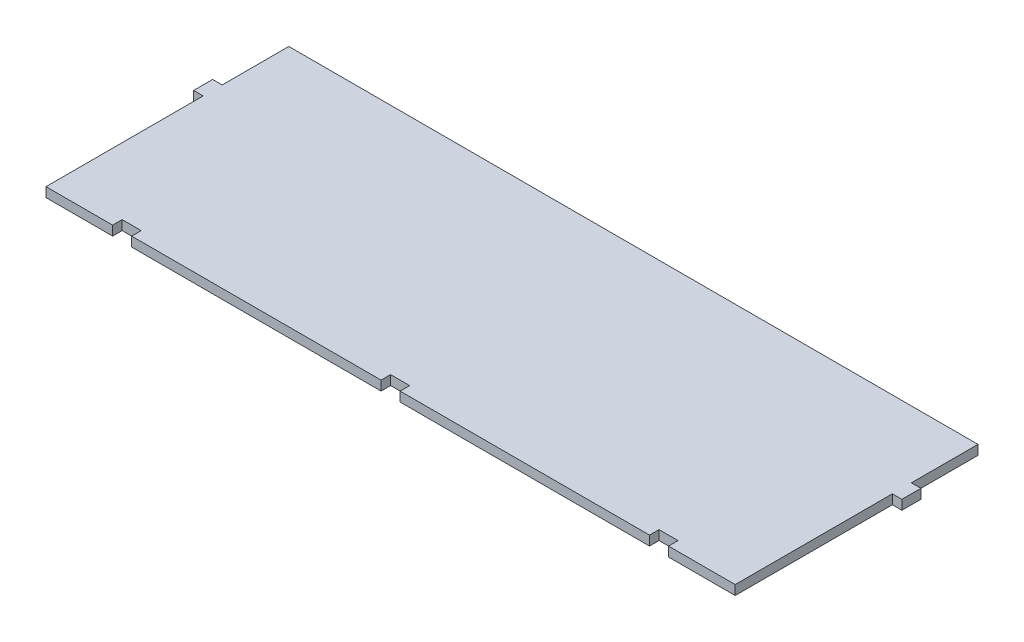
ISO-10303-21;
HEADER;
FILE_DESCRIPTION(('STEP AP214'),'2;1');
FILE_NAME('part.step','',(''),(''),'','','');
FILE_SCHEMA(('AUTOMOTIVE_DESIGN { 1 0 10303 214 1 1 1 1 }'));
ENDSEC;
DATA;
#1=APPLICATION_CONTEXT('core data for automotive mechanical design processes');
#2=APPLICATION_PROTOCOL_DEFINITION('international standard','automotive_design',2000,#1);
#3=PRODUCT_CONTEXT('',#1,'mechanical');
#4=PRODUCT('Part','Part','',(#3));
#5=PRODUCT_RELATED_PRODUCT_CATEGORY('part','',(#4));
#6=PRODUCT_DEFINITION_FORMATION('','',#4);
#7=PRODUCT_DEFINITION_CONTEXT('part definition',#1,'design');
#8=PRODUCT_DEFINITION('design','',#6,#7);
#9=PRODUCT_DEFINITION_SHAPE('','',#8);
#10=(LENGTH_UNIT() NAMED_UNIT(*) SI_UNIT(.MILLI.,.METRE.));
#11=(NAMED_UNIT(*) PLANE_ANGLE_UNIT() SI_UNIT($,.RADIAN.));
#12=(NAMED_UNIT(*) SI_UNIT($,.STERADIAN.) SOLID_ANGLE_UNIT());
#13=UNCERTAINTY_MEASURE_WITH_UNIT(LENGTH_MEASURE(1.E-05),#10,'distance_accuracy_value','');
#14=(GEOMETRIC_REPRESENTATION_CONTEXT(3) GLOBAL_UNCERTAINTY_ASSIGNED_CONTEXT((#13)) GLOBAL_UNIT_ASSIGNED_CONTEXT((#10,
#11,#12)) REPRESENTATION_CONTEXT('',''));
#15=CARTESIAN_POINT('',(0.,0.,0.));
#16=DIRECTION('',(0.,0.,1.));
#17=DIRECTION('',(1.,0.,0.));
#18=AXIS2_PLACEMENT_3D('',#15,#16,#17);
#19=CARTESIAN_POINT('',(-146.,5.,58.845));
#20=DIRECTION('',(0.,0.,-1.));
#21=DIRECTION('',(-1.,0.,0.));
#22=AXIS2_PLACEMENT_3D('',#19,#20,#21);
#23=PLANE('',#22);
#24=DIRECTION('',(1.,0.,0.));
#25=VECTOR('',#24,1.);
#26=CARTESIAN_POINT('',(-146.,0.,58.845));
#27=LINE('',#26,#25);
#28=CARTESIAN_POINT('',(-181.,0.,58.845));
#29=VERTEX_POINT('',#28);
#30=CARTESIAN_POINT('',(-146.,0.,58.845));
#31=VERTEX_POINT('',#30);
#32=EDGE_CURVE('E236',#29,#31,#27,.T.);
#33=ORIENTED_EDGE('',*,*,#32,.T.);
#34=DIRECTION('',(0.,-1.,0.));
#35=VECTOR('',#34,1.);
#36=CARTESIAN_POINT('',(-146.,5.,58.845));
#37=LINE('',#36,#35);
#38=CARTESIAN_POINT('',(-146.,5.,58.845));
#39=VERTEX_POINT('',#38);
#40=EDGE_CURVE('E11',#39,#31,#37,.T.);
#41=ORIENTED_EDGE('',*,*,#40,.F.);
#42=DIRECTION('',(1.,0.,0.));
#43=VECTOR('',#42,1.);
#44=CARTESIAN_POINT('',(-146.,5.,58.845));
#45=LINE('',#44,#43);
#46=CARTESIAN_POINT('',(-181.,5.,58.845));
#47=VERTEX_POINT('',#46);
#48=EDGE_CURVE('E306',#47,#39,#45,.T.);
#49=ORIENTED_EDGE('',*,*,#48,.F.);
#50=DIRECTION('',(0.,-1.,0.));
#51=VECTOR('',#50,1.);
#52=CARTESIAN_POINT('',(-181.,5.,58.845));
#53=LINE('',#52,#51);
#54=EDGE_CURVE('E232',#47,#29,#53,.T.);
#55=ORIENTED_EDGE('',*,*,#54,.T.);
#56=EDGE_LOOP('',(#33,#41,#49,#55));
#57=FACE_BOUND('',#56,.T.);
#58=ADVANCED_FACE('F39',(#57),#23,.F.);
#59=CARTESIAN_POINT('',(-146.,5.,58.845));
#60=DIRECTION('',(-1.,0.,0.));
#61=DIRECTION('',(0.,0.,1.));
#62=AXIS2_PLACEMENT_3D('',#59,#60,#61);
#63=PLANE('',#62);
#64=DIRECTION('',(0.,0.,-1.));
#65=VECTOR('',#64,1.);
#66=CARTESIAN_POINT('',(-146.,0.,58.845));
#67=LINE('',#66,#65);
#68=CARTESIAN_POINT('',(-146.,0.,53.845));
#69=VERTEX_POINT('',#68);
#70=EDGE_CURVE('E240',#31,#69,#67,.T.);
#71=ORIENTED_EDGE('',*,*,#70,.T.);
#72=DIRECTION('',(0.,-1.,0.));
#73=VECTOR('',#72,1.);
#74=CARTESIAN_POINT('',(-146.,5.,53.845));
#75=LINE('',#74,#73);
#76=CARTESIAN_POINT('',(-146.,5.,53.845));
#77=VERTEX_POINT('',#76);
#78=EDGE_CURVE('E48',#77,#69,#75,.T.);
#79=ORIENTED_EDGE('',*,*,#78,.F.);
#80=DIRECTION('',(0.,0.,-1.));
#81=VECTOR('',#80,1.);
#82=CARTESIAN_POINT('',(-146.,5.,58.845));
#83=LINE('',#82,#81);
#84=EDGE_CURVE('E147',#39,#77,#83,.T.);
#85=ORIENTED_EDGE('',*,*,#84,.F.);
#86=ORIENTED_EDGE('',*,*,#40,.T.);
#87=EDGE_LOOP('',(#71,#79,#85,#86));
#88=FACE_BOUND('',#87,.T.);
#89=ADVANCED_FACE('F484',(#88),#63,.F.);
#90=CARTESIAN_POINT('',(-146.,5.,53.845));
#91=DIRECTION('',(0.,0.,-1.));
#92=DIRECTION('',(-1.,0.,0.));
#93=AXIS2_PLACEMENT_3D('',#90,#91,#92);
#94=PLANE('',#93);
#95=DIRECTION('',(1.,0.,0.));
#96=VECTOR('',#95,1.);
#97=CARTESIAN_POINT('',(-146.,0.,53.845));
#98=LINE('',#97,#96);
#99=CARTESIAN_POINT('',(-136.,0.,53.845));
#100=VERTEX_POINT('',#99);
#101=EDGE_CURVE('E243',#69,#100,#98,.T.);
#102=ORIENTED_EDGE('',*,*,#101,.T.);
#103=DIRECTION('',(0.,-1.,0.));
#104=VECTOR('',#103,1.);
#105=CARTESIAN_POINT('',(-136.,5.,53.845));
#106=LINE('',#105,#104);
#107=CARTESIAN_POINT('',(-136.,5.,53.845));
#108=VERTEX_POINT('',#107);
#109=EDGE_CURVE('E381',#108,#100,#106,.T.);
#110=ORIENTED_EDGE('',*,*,#109,.F.);
#111=DIRECTION('',(1.,0.,0.));
#112=VECTOR('',#111,1.);
#113=CARTESIAN_POINT('',(-146.,5.,53.845));
#114=LINE('',#113,#112);
#115=EDGE_CURVE('E391',#77,#108,#114,.T.);
#116=ORIENTED_EDGE('',*,*,#115,.F.);
#117=ORIENTED_EDGE('',*,*,#78,.T.);
#118=EDGE_LOOP('',(#102,#110,#116,#117));
#119=FACE_BOUND('',#118,.T.);
#120=ADVANCED_FACE('F389',(#119),#94,.F.);
#121=CARTESIAN_POINT('',(-136.,5.,53.845));
#122=DIRECTION('',(1.,0.,0.));
#123=DIRECTION('',(0.,0.,-1.));
#124=AXIS2_PLACEMENT_3D('',#121,#122,#123);
#125=PLANE('',#124);
#126=DIRECTION('',(0.,0.,1.));
#127=VECTOR('',#126,1.);
#128=CARTESIAN_POINT('',(-136.,0.,53.845));
#129=LINE('',#128,#127);
#130=CARTESIAN_POINT('',(-136.,0.,58.845));
#131=VERTEX_POINT('',#130);
#132=EDGE_CURVE('E246',#100,#131,#129,.T.);
#133=ORIENTED_EDGE('',*,*,#132,.T.);
#134=DIRECTION('',(0.,-1.,0.));
#135=VECTOR('',#134,1.);
#136=CARTESIAN_POINT('',(-136.,5.,58.845));
#137=LINE('',#136,#135);
#138=CARTESIAN_POINT('',(-136.,5.,58.845));
#139=VERTEX_POINT('',#138);
#140=EDGE_CURVE('E377',#139,#131,#137,.T.);
#141=ORIENTED_EDGE('',*,*,#140,.F.);
#142=DIRECTION('',(0.,0.,1.));
#143=VECTOR('',#142,1.);
#144=CARTESIAN_POINT('',(-136.,5.,53.845));
#145=LINE('',#144,#143);
#146=EDGE_CURVE('E410',#108,#139,#145,.T.);
#147=ORIENTED_EDGE('',*,*,#146,.F.);
#148=ORIENTED_EDGE('',*,*,#109,.T.);
#149=EDGE_LOOP('',(#133,#141,#147,#148));
#150=FACE_BOUND('',#149,.T.);
#151=ADVANCED_FACE('F400',(#150),#125,.F.);
#152=CARTESIAN_POINT('',(-5.,5.,58.845));
#153=DIRECTION('',(0.,0.,-1.));
#154=DIRECTION('',(-1.,0.,0.));
#155=AXIS2_PLACEMENT_3D('',#152,#153,#154);
#156=PLANE('',#155);
#157=DIRECTION('',(1.,0.,0.));
#158=VECTOR('',#157,1.);
#159=CARTESIAN_POINT('',(-5.,0.,58.845));
#160=LINE('',#159,#158);
#161=CARTESIAN_POINT('',(-5.,0.,58.845));
#162=VERTEX_POINT('',#161);
#163=EDGE_CURVE('E249',#131,#162,#160,.T.);
#164=ORIENTED_EDGE('',*,*,#163,.T.);
#165=DIRECTION('',(0.,-1.,0.));
#166=VECTOR('',#165,1.);
#167=CARTESIAN_POINT('',(-5.,5.,58.845));
#168=LINE('',#167,#166);
#169=CARTESIAN_POINT('',(-5.,5.,58.845));
#170=VERTEX_POINT('',#169);
#171=EDGE_CURVE('E373',#170,#162,#168,.T.);
#172=ORIENTED_EDGE('',*,*,#171,.F.);
#173=DIRECTION('',(1.,0.,0.));
#174=VECTOR('',#173,1.);
#175=CARTESIAN_POINT('',(-5.,5.,58.845));
#176=LINE('',#175,#174);
#177=EDGE_CURVE('E406',#139,#170,#176,.T.);
#178=ORIENTED_EDGE('',*,*,#177,.F.);
#179=ORIENTED_EDGE('',*,*,#140,.T.);
#180=EDGE_LOOP('',(#164,#172,#178,#179));
#181=FACE_BOUND('',#180,.T.);
#182=ADVANCED_FACE('F404',(#181),#156,.F.);
#183=CARTESIAN_POINT('',(-5.,5.,53.845));
#184=DIRECTION('',(-1.,0.,0.));
#185=DIRECTION('',(0.,0.,1.));
#186=AXIS2_PLACEMENT_3D('',#183,#184,#185);
#187=PLANE('',#186);
#188=DIRECTION('',(0.,0.,-1.));
#189=VECTOR('',#188,1.);
#190=CARTESIAN_POINT('',(-5.,0.,53.845));
#191=LINE('',#190,#189);
#192=CARTESIAN_POINT('',(-5.,0.,53.845));
#193=VERTEX_POINT('',#192);
#194=EDGE_CURVE('E252',#162,#193,#191,.T.);
#195=ORIENTED_EDGE('',*,*,#194,.T.);
#196=DIRECTION('',(0.,-1.,0.));
#197=VECTOR('',#196,1.);
#198=CARTESIAN_POINT('',(-5.,5.,53.845));
#199=LINE('',#198,#197);
#200=CARTESIAN_POINT('',(-5.,5.,53.845));
#201=VERTEX_POINT('',#200);
#202=EDGE_CURVE('E369',#201,#193,#199,.T.);
#203=ORIENTED_EDGE('',*,*,#202,.F.);
#204=DIRECTION('',(0.,0.,-1.));
#205=VECTOR('',#204,1.);
#206=CARTESIAN_POINT('',(-5.,5.,53.845));
#207=LINE('',#206,#205);
#208=EDGE_CURVE('E409',#170,#201,#207,.T.);
#209=ORIENTED_EDGE('',*,*,#208,.F.);
#210=ORIENTED_EDGE('',*,*,#171,.T.);
#211=EDGE_LOOP('',(#195,#203,#209,#210));
#212=FACE_BOUND('',#211,.T.);
#213=ADVANCED_FACE('F497',(#212),#187,.F.);
#214=CARTESIAN_POINT('',(-5.,5.,53.845));
#215=DIRECTION('',(0.,0.,-1.));
#216=DIRECTION('',(-1.,0.,0.));
#217=AXIS2_PLACEMENT_3D('',#214,#215,#216);
#218=PLANE('',#217);
#219=DIRECTION('',(1.,0.,0.));
#220=VECTOR('',#219,1.);
#221=CARTESIAN_POINT('',(-5.,0.,53.845));
#222=LINE('',#221,#220);
#223=CARTESIAN_POINT('',(5.,0.,53.845));
#224=VERTEX_POINT('',#223);
#225=EDGE_CURVE('E255',#193,#224,#222,.T.);
#226=ORIENTED_EDGE('',*,*,#225,.T.);
#227=DIRECTION('',(0.,-1.,0.));
#228=VECTOR('',#227,1.);
#229=CARTESIAN_POINT('',(5.,5.,53.845));
#230=LINE('',#229,#228);
#231=CARTESIAN_POINT('',(5.,5.,53.845));
#232=VERTEX_POINT('',#231);
#233=EDGE_CURVE('E365',#232,#224,#230,.T.);
#234=ORIENTED_EDGE('',*,*,#233,.F.);
#235=DIRECTION('',(1.,0.,0.));
#236=VECTOR('',#235,1.);
#237=CARTESIAN_POINT('',(-5.,5.,53.845));
#238=LINE('',#237,#236);
#239=EDGE_CURVE('E414',#201,#232,#238,.T.);
#240=ORIENTED_EDGE('',*,*,#239,.F.);
#241=ORIENTED_EDGE('',*,*,#202,.T.);
#242=EDGE_LOOP('',(#226,#234,#240,#241));
#243=FACE_BOUND('',#242,.T.);
#244=ADVANCED_FACE('F500',(#243),#218,.F.);
#245=CARTESIAN_POINT('',(5.,5.,53.845));
#246=DIRECTION('',(1.,0.,0.));
#247=DIRECTION('',(0.,0.,-1.));
#248=AXIS2_PLACEMENT_3D('',#245,#246,#247);
#249=PLANE('',#248);
#250=DIRECTION('',(0.,0.,1.));
#251=VECTOR('',#250,1.);
#252=CARTESIAN_POINT('',(5.,0.,53.845));
#253=LINE('',#252,#251);
#254=CARTESIAN_POINT('',(5.,0.,58.845));
#255=VERTEX_POINT('',#254);
#256=EDGE_CURVE('E258',#224,#255,#253,.T.);
#257=ORIENTED_EDGE('',*,*,#256,.T.);
#258=DIRECTION('',(0.,-1.,0.));
#259=VECTOR('',#258,1.);
#260=CARTESIAN_POINT('',(5.,5.,58.845));
#261=LINE('',#260,#259);
#262=CARTESIAN_POINT('',(5.,5.,58.845));
#263=VERTEX_POINT('',#262);
#264=EDGE_CURVE('E361',#263,#255,#261,.T.);
#265=ORIENTED_EDGE('',*,*,#264,.F.);
#266=DIRECTION('',(0.,0.,1.));
#267=VECTOR('',#266,1.);
#268=CARTESIAN_POINT('',(5.,5.,53.845));
#269=LINE('',#268,#267);
#270=EDGE_CURVE('E421',#232,#263,#269,.T.);
#271=ORIENTED_EDGE('',*,*,#270,.F.);
#272=ORIENTED_EDGE('',*,*,#233,.T.);
#273=EDGE_LOOP('',(#257,#265,#271,#272));
#274=FACE_BOUND('',#273,.T.);
#275=ADVANCED_FACE('F504',(#274),#249,.F.);
#276=CARTESIAN_POINT('',(136.,5.,58.845));
#277=DIRECTION('',(0.,0.,-1.));
#278=DIRECTION('',(-1.,0.,0.));
#279=AXIS2_PLACEMENT_3D('',#276,#277,#278);
#280=PLANE('',#279);
#281=DIRECTION('',(1.,0.,0.));
#282=VECTOR('',#281,1.);
#283=CARTESIAN_POINT('',(136.,0.,58.845));
#284=LINE('',#283,#282);
#285=CARTESIAN_POINT('',(136.,0.,58.845));
#286=VERTEX_POINT('',#285);
#287=EDGE_CURVE('E261',#255,#286,#284,.T.);
#288=ORIENTED_EDGE('',*,*,#287,.T.);
#289=DIRECTION('',(0.,-1.,0.));
#290=VECTOR('',#289,1.);
#291=CARTESIAN_POINT('',(136.,5.,58.845));
#292=LINE('',#291,#290);
#293=CARTESIAN_POINT('',(136.,5.,58.845));
#294=VERTEX_POINT('',#293);
#295=EDGE_CURVE('E357',#294,#286,#292,.T.);
#296=ORIENTED_EDGE('',*,*,#295,.F.);
#297=DIRECTION('',(1.,0.,0.));
#298=VECTOR('',#297,1.);
#299=CARTESIAN_POINT('',(136.,5.,58.845));
#300=LINE('',#299,#298);
#301=EDGE_CURVE('E424',#263,#294,#300,.T.);
#302=ORIENTED_EDGE('',*,*,#301,.F.);
#303=ORIENTED_EDGE('',*,*,#264,.T.);
#304=EDGE_LOOP('',(#288,#296,#302,#303));
#305=FACE_BOUND('',#304,.T.);
#306=ADVANCED_FACE('F508',(#305),#280,.F.);
#307=CARTESIAN_POINT('',(136.,5.,53.845));
#308=DIRECTION('',(-1.,0.,0.));
#309=DIRECTION('',(0.,0.,1.));
#310=AXIS2_PLACEMENT_3D('',#307,#308,#309);
#311=PLANE('',#310);
#312=DIRECTION('',(0.,0.,-1.));
#313=VECTOR('',#312,1.);
#314=CARTESIAN_POINT('',(136.,0.,53.845));
#315=LINE('',#314,#313);
#316=CARTESIAN_POINT('',(136.,0.,53.845));
#317=VERTEX_POINT('',#316);
#318=EDGE_CURVE('E264',#286,#317,#315,.T.);
#319=ORIENTED_EDGE('',*,*,#318,.T.);
#320=DIRECTION('',(0.,-1.,0.));
#321=VECTOR('',#320,1.);
#322=CARTESIAN_POINT('',(136.,5.,53.845));
#323=LINE('',#322,#321);
#324=CARTESIAN_POINT('',(136.,5.,53.845));
#325=VERTEX_POINT('',#324);
#326=EDGE_CURVE('E353',#325,#317,#323,.T.);
#327=ORIENTED_EDGE('',*,*,#326,.F.);
#328=DIRECTION('',(0.,0.,-1.));
#329=VECTOR('',#328,1.);
#330=CARTESIAN_POINT('',(136.,5.,53.845));
#331=LINE('',#330,#329);
#332=EDGE_CURVE('E427',#294,#325,#331,.T.);
#333=ORIENTED_EDGE('',*,*,#332,.F.);
#334=ORIENTED_EDGE('',*,*,#295,.T.);
#335=EDGE_LOOP('',(#319,#327,#333,#334));
#336=FACE_BOUND('',#335,.T.);
#337=ADVANCED_FACE('F512',(#336),#311,.F.);
#338=CARTESIAN_POINT('',(146.,5.,53.845));
#339=DIRECTION('',(0.,0.,-1.));
#340=DIRECTION('',(-1.,0.,0.));
#341=AXIS2_PLACEMENT_3D('',#338,#339,#340);
#342=PLANE('',#341);
#343=DIRECTION('',(1.,0.,0.));
#344=VECTOR('',#343,1.);
#345=CARTESIAN_POINT('',(146.,0.,53.845));
#346=LINE('',#345,#344);
#347=CARTESIAN_POINT('',(146.,0.,53.845));
#348=VERTEX_POINT('',#347);
#349=EDGE_CURVE('E267',#317,#348,#346,.T.);
#350=ORIENTED_EDGE('',*,*,#349,.T.);
#351=DIRECTION('',(0.,-1.,0.));
#352=VECTOR('',#351,1.);
#353=CARTESIAN_POINT('',(146.,5.,53.845));
#354=LINE('',#353,#352);
#355=CARTESIAN_POINT('',(146.,5.,53.845));
#356=VERTEX_POINT('',#355);
#357=EDGE_CURVE('E349',#356,#348,#354,.T.);
#358=ORIENTED_EDGE('',*,*,#357,.F.);
#359=DIRECTION('',(1.,0.,0.));
#360=VECTOR('',#359,1.);
#361=CARTESIAN_POINT('',(146.,5.,53.845));
#362=LINE('',#361,#360);
#363=EDGE_CURVE('E430',#325,#356,#362,.T.);
#364=ORIENTED_EDGE('',*,*,#363,.F.);
#365=ORIENTED_EDGE('',*,*,#326,.T.);
#366=EDGE_LOOP('',(#350,#358,#364,#365));
#367=FACE_BOUND('',#366,.T.);
#368=ADVANCED_FACE('F516',(#367),#342,.F.);
#369=CARTESIAN_POINT('',(146.,5.,58.845));
#370=DIRECTION('',(1.,0.,0.));
#371=DIRECTION('',(0.,0.,-1.));
#372=AXIS2_PLACEMENT_3D('',#369,#370,#371);
#373=PLANE('',#372);
#374=DIRECTION('',(0.,0.,1.));
#375=VECTOR('',#374,1.);
#376=CARTESIAN_POINT('',(146.,0.,58.845));
#377=LINE('',#376,#375);
#378=CARTESIAN_POINT('',(146.,0.,58.845));
#379=VERTEX_POINT('',#378);
#380=EDGE_CURVE('E270',#348,#379,#377,.T.);
#381=ORIENTED_EDGE('',*,*,#380,.T.);
#382=DIRECTION('',(0.,-1.,0.));
#383=VECTOR('',#382,1.);
#384=CARTESIAN_POINT('',(146.,5.,58.845));
#385=LINE('',#384,#383);
#386=CARTESIAN_POINT('',(146.,5.,58.845));
#387=VERTEX_POINT('',#386);
#388=EDGE_CURVE('E345',#387,#379,#385,.T.);
#389=ORIENTED_EDGE('',*,*,#388,.F.);
#390=DIRECTION('',(0.,0.,1.));
#391=VECTOR('',#390,1.);
#392=CARTESIAN_POINT('',(146.,5.,58.845));
#393=LINE('',#392,#391);
#394=EDGE_CURVE('E433',#356,#387,#393,.T.);
#395=ORIENTED_EDGE('',*,*,#394,.F.);
#396=ORIENTED_EDGE('',*,*,#357,.T.);
#397=EDGE_LOOP('',(#381,#389,#395,#396));
#398=FACE_BOUND('',#397,.T.);
#399=ADVANCED_FACE('F520',(#398),#373,.F.);
#400=CARTESIAN_POINT('',(181.,5.,58.845));
#401=DIRECTION('',(0.,0.,-1.));
#402=DIRECTION('',(-1.,0.,0.));
#403=AXIS2_PLACEMENT_3D('',#400,#401,#402);
#404=PLANE('',#403);
#405=DIRECTION('',(1.,0.,0.));
#406=VECTOR('',#405,1.);
#407=CARTESIAN_POINT('',(181.,0.,58.845));
#408=LINE('',#407,#406);
#409=CARTESIAN_POINT('',(181.,0.,58.845));
#410=VERTEX_POINT('',#409);
#411=EDGE_CURVE('E273',#379,#410,#408,.T.);
#412=ORIENTED_EDGE('',*,*,#411,.T.);
#413=DIRECTION('',(0.,-1.,0.));
#414=VECTOR('',#413,1.);
#415=CARTESIAN_POINT('',(181.,5.,58.845));
#416=LINE('',#415,#414);
#417=CARTESIAN_POINT('',(181.,5.,58.845));
#418=VERTEX_POINT('',#417);
#419=EDGE_CURVE('E341',#418,#410,#416,.T.);
#420=ORIENTED_EDGE('',*,*,#419,.F.);
#421=DIRECTION('',(1.,0.,0.));
#422=VECTOR('',#421,1.);
#423=CARTESIAN_POINT('',(181.,5.,58.845));
#424=LINE('',#423,#422);
#425=EDGE_CURVE('E436',#387,#418,#424,.T.);
#426=ORIENTED_EDGE('',*,*,#425,.F.);
#427=ORIENTED_EDGE('',*,*,#388,.T.);
#428=EDGE_LOOP('',(#412,#420,#426,#427));
#429=FACE_BOUND('',#428,.T.);
#430=ADVANCED_FACE('F524',(#429),#404,.F.);
#431=CARTESIAN_POINT('',(181.,5.,-23.695));
#432=DIRECTION('',(-1.,0.,0.));
#433=DIRECTION('',(0.,0.,1.));
#434=AXIS2_PLACEMENT_3D('',#431,#432,#433);
#435=PLANE('',#434);
#436=DIRECTION('',(0.,0.,-1.));
#437=VECTOR('',#436,1.);
#438=CARTESIAN_POINT('',(181.,0.,-23.695));
#439=LINE('',#438,#437);
#440=CARTESIAN_POINT('',(181.,0.,-23.695));
#441=VERTEX_POINT('',#440);
#442=EDGE_CURVE('E276',#410,#441,#439,.T.);
#443=ORIENTED_EDGE('',*,*,#442,.T.);
#444=DIRECTION('',(0.,-1.,0.));
#445=VECTOR('',#444,1.);
#446=CARTESIAN_POINT('',(181.,5.,-23.695));
#447=LINE('',#446,#445);
#448=CARTESIAN_POINT('',(181.,5.,-23.695));
#449=VERTEX_POINT('',#448);
#450=EDGE_CURVE('E337',#449,#441,#447,.T.);
#451=ORIENTED_EDGE('',*,*,#450,.F.);
#452=DIRECTION('',(0.,0.,-1.));
#453=VECTOR('',#452,1.);
#454=CARTESIAN_POINT('',(181.,5.,-23.695));
#455=LINE('',#454,#453);
#456=EDGE_CURVE('E439',#418,#449,#455,.T.);
#457=ORIENTED_EDGE('',*,*,#456,.F.);
#458=ORIENTED_EDGE('',*,*,#419,.T.);
#459=EDGE_LOOP('',(#443,#451,#457,#458));
#460=FACE_BOUND('',#459,.T.);
#461=ADVANCED_FACE('F528',(#460),#435,.F.);
#462=CARTESIAN_POINT('',(181.,5.,-23.695));
#463=DIRECTION('',(0.,0.,-1.));
#464=DIRECTION('',(-1.,0.,0.));
#465=AXIS2_PLACEMENT_3D('',#462,#463,#464);
#466=PLANE('',#465);
#467=DIRECTION('',(1.,0.,0.));
#468=VECTOR('',#467,1.);
#469=CARTESIAN_POINT('',(181.,0.,-23.695));
#470=LINE('',#469,#468);
#471=CARTESIAN_POINT('',(186.,0.,-23.695));
#472=VERTEX_POINT('',#471);
#473=EDGE_CURVE('E279',#441,#472,#470,.T.);
#474=ORIENTED_EDGE('',*,*,#473,.T.);
#475=DIRECTION('',(0.,-1.,0.));
#476=VECTOR('',#475,1.);
#477=CARTESIAN_POINT('',(186.,5.,-23.695));
#478=LINE('',#477,#476);
#479=CARTESIAN_POINT('',(186.,5.,-23.695));
#480=VERTEX_POINT('',#479);
#481=EDGE_CURVE('E333',#480,#472,#478,.T.);
#482=ORIENTED_EDGE('',*,*,#481,.F.);
#483=DIRECTION('',(1.,0.,0.));
#484=VECTOR('',#483,1.);
#485=CARTESIAN_POINT('',(181.,5.,-23.695));
#486=LINE('',#485,#484);
#487=EDGE_CURVE('E442',#449,#480,#486,.T.);
#488=ORIENTED_EDGE('',*,*,#487,.F.);
#489=ORIENTED_EDGE('',*,*,#450,.T.);
#490=EDGE_LOOP('',(#474,#482,#488,#489));
#491=FACE_BOUND('',#490,.T.);
#492=ADVANCED_FACE('F532',(#491),#466,.F.);
#493=CARTESIAN_POINT('',(186.,5.,-33.695));
#494=DIRECTION('',(-1.,0.,0.));
#495=DIRECTION('',(0.,0.,1.));
#496=AXIS2_PLACEMENT_3D('',#493,#494,#495);
#497=PLANE('',#496);
#498=DIRECTION('',(0.,0.,-1.));
#499=VECTOR('',#498,1.);
#500=CARTESIAN_POINT('',(186.,0.,-33.695));
#501=LINE('',#500,#499);
#502=CARTESIAN_POINT('',(186.,0.,-33.695));
#503=VERTEX_POINT('',#502);
#504=EDGE_CURVE('E282',#472,#503,#501,.T.);
#505=ORIENTED_EDGE('',*,*,#504,.T.);
#506=DIRECTION('',(0.,-1.,0.));
#507=VECTOR('',#506,1.);
#508=CARTESIAN_POINT('',(186.,5.,-33.695));
#509=LINE('',#508,#507);
#510=CARTESIAN_POINT('',(186.,5.,-33.695));
#511=VERTEX_POINT('',#510);
#512=EDGE_CURVE('E329',#511,#503,#509,.T.);
#513=ORIENTED_EDGE('',*,*,#512,.F.);
#514=DIRECTION('',(0.,0.,-1.));
#515=VECTOR('',#514,1.);
#516=CARTESIAN_POINT('',(186.,5.,-33.695));
#517=LINE('',#516,#515);
#518=EDGE_CURVE('E445',#480,#511,#517,.T.);
#519=ORIENTED_EDGE('',*,*,#518,.F.);
#520=ORIENTED_EDGE('',*,*,#481,.T.);
#521=EDGE_LOOP('',(#505,#513,#519,#520));
#522=FACE_BOUND('',#521,.T.);
#523=ADVANCED_FACE('F536',(#522),#497,.F.);
#524=CARTESIAN_POINT('',(186.,5.,-33.695));
#525=DIRECTION('',(0.,0.,1.));
#526=DIRECTION('',(1.,0.,0.));
#527=AXIS2_PLACEMENT_3D('',#524,#525,#526);
#528=PLANE('',#527);
#529=DIRECTION('',(-1.,0.,0.));
#530=VECTOR('',#529,1.);
#531=CARTESIAN_POINT('',(186.,0.,-33.695));
#532=LINE('',#531,#530);
#533=CARTESIAN_POINT('',(181.,0.,-33.695));
#534=VERTEX_POINT('',#533);
#535=EDGE_CURVE('E285',#503,#534,#532,.T.);
#536=ORIENTED_EDGE('',*,*,#535,.T.);
#537=DIRECTION('',(0.,-1.,0.));
#538=VECTOR('',#537,1.);
#539=CARTESIAN_POINT('',(181.,5.,-33.695));
#540=LINE('',#539,#538);
#541=CARTESIAN_POINT('',(181.,5.,-33.695));
#542=VERTEX_POINT('',#541);
#543=EDGE_CURVE('E325',#542,#534,#540,.T.);
#544=ORIENTED_EDGE('',*,*,#543,.F.);
#545=DIRECTION('',(-1.,0.,0.));
#546=VECTOR('',#545,1.);
#547=CARTESIAN_POINT('',(186.,5.,-33.695));
#548=LINE('',#547,#546);
#549=EDGE_CURVE('E448',#511,#542,#548,.T.);
#550=ORIENTED_EDGE('',*,*,#549,.F.);
#551=ORIENTED_EDGE('',*,*,#512,.T.);
#552=EDGE_LOOP('',(#536,#544,#550,#551));
#553=FACE_BOUND('',#552,.T.);
#554=ADVANCED_FACE('F540',(#553),#528,.F.);
#555=CARTESIAN_POINT('',(181.,5.,-68.695));
#556=DIRECTION('',(-1.,0.,0.));
#557=DIRECTION('',(0.,0.,1.));
#558=AXIS2_PLACEMENT_3D('',#555,#556,#557);
#559=PLANE('',#558);
#560=DIRECTION('',(0.,0.,-1.));
#561=VECTOR('',#560,1.);
#562=CARTESIAN_POINT('',(181.,0.,-68.695));
#563=LINE('',#562,#561);
#564=CARTESIAN_POINT('',(181.,0.,-68.695));
#565=VERTEX_POINT('',#564);
#566=EDGE_CURVE('E288',#534,#565,#563,.T.);
#567=ORIENTED_EDGE('',*,*,#566,.T.);
#568=DIRECTION('',(0.,-1.,0.));
#569=VECTOR('',#568,1.);
#570=CARTESIAN_POINT('',(181.,5.,-68.695));
#571=LINE('',#570,#569);
#572=CARTESIAN_POINT('',(181.,5.,-68.695));
#573=VERTEX_POINT('',#572);
#574=EDGE_CURVE('E321',#573,#565,#571,.T.);
#575=ORIENTED_EDGE('',*,*,#574,.F.);
#576=DIRECTION('',(0.,0.,-1.));
#577=VECTOR('',#576,1.);
#578=CARTESIAN_POINT('',(181.,5.,-68.695));
#579=LINE('',#578,#577);
#580=EDGE_CURVE('E451',#542,#573,#579,.T.);
#581=ORIENTED_EDGE('',*,*,#580,.F.);
#582=ORIENTED_EDGE('',*,*,#543,.T.);
#583=EDGE_LOOP('',(#567,#575,#581,#582));
#584=FACE_BOUND('',#583,.T.);
#585=ADVANCED_FACE('F544',(#584),#559,.F.);
#586=CARTESIAN_POINT('',(181.,5.,-68.695));
#587=DIRECTION('',(0.,0.,1.));
#588=DIRECTION('',(1.,0.,0.));
#589=AXIS2_PLACEMENT_3D('',#586,#587,#588);
#590=PLANE('',#589);
#591=DIRECTION('',(-1.,0.,0.));
#592=VECTOR('',#591,1.);
#593=CARTESIAN_POINT('',(181.,0.,-68.695));
#594=LINE('',#593,#592);
#595=CARTESIAN_POINT('',(-181.,0.,-68.695));
#596=VERTEX_POINT('',#595);
#597=EDGE_CURVE('E291',#565,#596,#594,.T.);
#598=ORIENTED_EDGE('',*,*,#597,.T.);
#599=DIRECTION('',(0.,-1.,0.));
#600=VECTOR('',#599,1.);
#601=CARTESIAN_POINT('',(-181.,5.,-68.695));
#602=LINE('',#601,#600);
#603=CARTESIAN_POINT('',(-181.,5.,-68.695));
#604=VERTEX_POINT('',#603);
#605=EDGE_CURVE('E317',#604,#596,#602,.T.);
#606=ORIENTED_EDGE('',*,*,#605,.F.);
#607=DIRECTION('',(-1.,0.,0.));
#608=VECTOR('',#607,1.);
#609=CARTESIAN_POINT('',(181.,5.,-68.695));
#610=LINE('',#609,#608);
#611=EDGE_CURVE('E454',#573,#604,#610,.T.);
#612=ORIENTED_EDGE('',*,*,#611,.F.);
#613=ORIENTED_EDGE('',*,*,#574,.T.);
#614=EDGE_LOOP('',(#598,#606,#612,#613));
#615=FACE_BOUND('',#614,.T.);
#616=ADVANCED_FACE('F548',(#615),#590,.F.);
#617=CARTESIAN_POINT('',(-181.,5.,-68.695));
#618=DIRECTION('',(1.,0.,0.));
#619=DIRECTION('',(0.,0.,-1.));
#620=AXIS2_PLACEMENT_3D('',#617,#618,#619);
#621=PLANE('',#620);
#622=DIRECTION('',(0.,0.,1.));
#623=VECTOR('',#622,1.);
#624=CARTESIAN_POINT('',(-181.,0.,-68.695));
#625=LINE('',#624,#623);
#626=CARTESIAN_POINT('',(-181.,0.,-33.695));
#627=VERTEX_POINT('',#626);
#628=EDGE_CURVE('E294',#596,#627,#625,.T.);
#629=ORIENTED_EDGE('',*,*,#628,.T.);
#630=DIRECTION('',(0.,-1.,0.));
#631=VECTOR('',#630,1.);
#632=CARTESIAN_POINT('',(-181.,5.,-33.695));
#633=LINE('',#632,#631);
#634=CARTESIAN_POINT('',(-181.,5.,-33.695));
#635=VERTEX_POINT('',#634);
#636=EDGE_CURVE('E313',#635,#627,#633,.T.);
#637=ORIENTED_EDGE('',*,*,#636,.F.);
#638=DIRECTION('',(0.,0.,1.));
#639=VECTOR('',#638,1.);
#640=CARTESIAN_POINT('',(-181.,5.,-68.695));
#641=LINE('',#640,#639);
#642=EDGE_CURVE('E457',#604,#635,#641,.T.);
#643=ORIENTED_EDGE('',*,*,#642,.F.);
#644=ORIENTED_EDGE('',*,*,#605,.T.);
#645=EDGE_LOOP('',(#629,#637,#643,#644));
#646=FACE_BOUND('',#645,.T.);
#647=ADVANCED_FACE('F465',(#646),#621,.F.);
#648=CARTESIAN_POINT('',(-186.,5.,-33.695));
#649=DIRECTION('',(0.,0.,1.));
#650=DIRECTION('',(1.,0.,0.));
#651=AXIS2_PLACEMENT_3D('',#648,#649,#650);
#652=PLANE('',#651);
#653=DIRECTION('',(-1.,0.,0.));
#654=VECTOR('',#653,1.);
#655=CARTESIAN_POINT('',(-186.,0.,-33.695));
#656=LINE('',#655,#654);
#657=CARTESIAN_POINT('',(-186.,0.,-33.695));
#658=VERTEX_POINT('',#657);
#659=EDGE_CURVE('E297',#627,#658,#656,.T.);
#660=ORIENTED_EDGE('',*,*,#659,.T.);
#661=DIRECTION('',(0.,-1.,0.));
#662=VECTOR('',#661,1.);
#663=CARTESIAN_POINT('',(-186.,5.,-33.695));
#664=LINE('',#663,#662);
#665=CARTESIAN_POINT('',(-186.,5.,-33.695));
#666=VERTEX_POINT('',#665);
#667=EDGE_CURVE('E225',#666,#658,#664,.T.);
#668=ORIENTED_EDGE('',*,*,#667,.F.);
#669=DIRECTION('',(-1.,0.,0.));
#670=VECTOR('',#669,1.);
#671=CARTESIAN_POINT('',(-186.,5.,-33.695));
#672=LINE('',#671,#670);
#673=EDGE_CURVE('E214',#635,#666,#672,.T.);
#674=ORIENTED_EDGE('',*,*,#673,.F.);
#675=ORIENTED_EDGE('',*,*,#636,.T.);
#676=EDGE_LOOP('',(#660,#668,#674,#675));
#677=FACE_BOUND('',#676,.T.);
#678=ADVANCED_FACE('F469',(#677),#652,.F.);
#679=CARTESIAN_POINT('',(-186.,5.,-33.695));
#680=DIRECTION('',(1.,0.,0.));
#681=DIRECTION('',(0.,0.,-1.));
#682=AXIS2_PLACEMENT_3D('',#679,#680,#681);
#683=PLANE('',#682);
#684=DIRECTION('',(0.,0.,1.));
#685=VECTOR('',#684,1.);
#686=CARTESIAN_POINT('',(-186.,0.,-33.695));
#687=LINE('',#686,#685);
#688=CARTESIAN_POINT('',(-186.,0.,-23.695));
#689=VERTEX_POINT('',#688);
#690=EDGE_CURVE('E223',#658,#689,#687,.T.);
#691=ORIENTED_EDGE('',*,*,#690,.T.);
#692=DIRECTION('',(0.,-1.,0.));
#693=VECTOR('',#692,1.);
#694=CARTESIAN_POINT('',(-186.,5.,-23.695));
#695=LINE('',#694,#693);
#696=CARTESIAN_POINT('',(-186.,5.,-23.695));
#697=VERTEX_POINT('',#696);
#698=EDGE_CURVE('E220',#697,#689,#695,.T.);
#699=ORIENTED_EDGE('',*,*,#698,.F.);
#700=DIRECTION('',(0.,0.,1.));
#701=VECTOR('',#700,1.);
#702=CARTESIAN_POINT('',(-186.,5.,-33.695));
#703=LINE('',#702,#701);
#704=EDGE_CURVE('E208',#666,#697,#703,.T.);
#705=ORIENTED_EDGE('',*,*,#704,.F.);
#706=ORIENTED_EDGE('',*,*,#667,.T.);
#707=EDGE_LOOP('',(#691,#699,#705,#706));
#708=FACE_BOUND('',#707,.T.);
#709=ADVANCED_FACE('F221',(#708),#683,.F.);
#710=CARTESIAN_POINT('',(-181.,5.,-23.695));
#711=DIRECTION('',(0.,0.,-1.));
#712=DIRECTION('',(-1.,0.,0.));
#713=AXIS2_PLACEMENT_3D('',#710,#711,#712);
#714=PLANE('',#713);
#715=DIRECTION('',(1.,0.,0.));
#716=VECTOR('',#715,1.);
#717=CARTESIAN_POINT('',(-181.,0.,-23.695));
#718=LINE('',#717,#716);
#719=CARTESIAN_POINT('',(-181.,0.,-23.695));
#720=VERTEX_POINT('',#719);
#721=EDGE_CURVE('E133',#689,#720,#718,.T.);
#722=ORIENTED_EDGE('',*,*,#721,.T.);
#723=DIRECTION('',(0.,-1.,0.));
#724=VECTOR('',#723,1.);
#725=CARTESIAN_POINT('',(-181.,5.,-23.695));
#726=LINE('',#725,#724);
#727=CARTESIAN_POINT('',(-181.,5.,-23.695));
#728=VERTEX_POINT('',#727);
#729=EDGE_CURVE('E226',#728,#720,#726,.T.);
#730=ORIENTED_EDGE('',*,*,#729,.F.);
#731=DIRECTION('',(1.,0.,0.));
#732=VECTOR('',#731,1.);
#733=CARTESIAN_POINT('',(-181.,5.,-23.695));
#734=LINE('',#733,#732);
#735=EDGE_CURVE('E212',#697,#728,#734,.T.);
#736=ORIENTED_EDGE('',*,*,#735,.F.);
#737=ORIENTED_EDGE('',*,*,#698,.T.);
#738=EDGE_LOOP('',(#722,#730,#736,#737));
#739=FACE_BOUND('',#738,.T.);
#740=ADVANCED_FACE('F228',(#739),#714,.F.);
#741=CARTESIAN_POINT('',(-181.,5.,-23.695));
#742=DIRECTION('',(1.,0.,0.));
#743=DIRECTION('',(0.,0.,-1.));
#744=AXIS2_PLACEMENT_3D('',#741,#742,#743);
#745=PLANE('',#744);
#746=DIRECTION('',(0.,0.,1.));
#747=VECTOR('',#746,1.);
#748=CARTESIAN_POINT('',(-181.,0.,-23.695));
#749=LINE('',#748,#747);
#750=EDGE_CURVE('E139',#720,#29,#749,.T.);
#751=ORIENTED_EDGE('',*,*,#750,.T.);
#752=ORIENTED_EDGE('',*,*,#54,.F.);
#753=DIRECTION('',(0.,0.,1.));
#754=VECTOR('',#753,1.);
#755=CARTESIAN_POINT('',(-181.,5.,-23.695));
#756=LINE('',#755,#754);
#757=EDGE_CURVE('E56',#728,#47,#756,.T.);
#758=ORIENTED_EDGE('',*,*,#757,.F.);
#759=ORIENTED_EDGE('',*,*,#729,.T.);
#760=EDGE_LOOP('',(#751,#752,#758,#759));
#761=FACE_BOUND('',#760,.T.);
#762=ADVANCED_FACE('F473',(#761),#745,.F.);
#763=CARTESIAN_POINT('',(0.,5.,0.));
#764=DIRECTION('',(0.,1.,0.));
#765=DIRECTION('',(0.,0.,1.));
#766=AXIS2_PLACEMENT_3D('',#763,#764,#765);
#767=PLANE('',#766);
#768=ORIENTED_EDGE('',*,*,#48,.T.);
#769=ORIENTED_EDGE('',*,*,#84,.T.);
#770=ORIENTED_EDGE('',*,*,#115,.T.);
#771=ORIENTED_EDGE('',*,*,#146,.T.);
#772=ORIENTED_EDGE('',*,*,#177,.T.);
#773=ORIENTED_EDGE('',*,*,#208,.T.);
#774=ORIENTED_EDGE('',*,*,#239,.T.);
#775=ORIENTED_EDGE('',*,*,#270,.T.);
#776=ORIENTED_EDGE('',*,*,#301,.T.);
#777=ORIENTED_EDGE('',*,*,#332,.T.);
#778=ORIENTED_EDGE('',*,*,#363,.T.);
#779=ORIENTED_EDGE('',*,*,#394,.T.);
#780=ORIENTED_EDGE('',*,*,#425,.T.);
#781=ORIENTED_EDGE('',*,*,#456,.T.);
#782=ORIENTED_EDGE('',*,*,#487,.T.);
#783=ORIENTED_EDGE('',*,*,#518,.T.);
#784=ORIENTED_EDGE('',*,*,#549,.T.);
#785=ORIENTED_EDGE('',*,*,#580,.T.);
#786=ORIENTED_EDGE('',*,*,#611,.T.);
#787=ORIENTED_EDGE('',*,*,#642,.T.);
#788=ORIENTED_EDGE('',*,*,#673,.T.);
#789=ORIENTED_EDGE('',*,*,#704,.T.);
#790=ORIENTED_EDGE('',*,*,#735,.T.);
#791=ORIENTED_EDGE('',*,*,#757,.T.);
#792=EDGE_LOOP('',(#768,#769,#770,#771,#772,#773,#774,#775,#776,#777,#778,#779,#780,#781,#782,
#783,#784,#785,#786,#787,#788,#789,#790,#791));
#793=FACE_BOUND('',#792,.T.);
#794=ADVANCED_FACE('F210',(#793),#767,.T.);
#795=CARTESIAN_POINT('',(0.,0.,0.));
#796=DIRECTION('',(0.,1.,0.));
#797=DIRECTION('',(0.,0.,1.));
#798=AXIS2_PLACEMENT_3D('',#795,#796,#797);
#799=PLANE('',#798);
#800=ORIENTED_EDGE('',*,*,#32,.F.);
#801=ORIENTED_EDGE('',*,*,#750,.F.);
#802=ORIENTED_EDGE('',*,*,#721,.F.);
#803=ORIENTED_EDGE('',*,*,#690,.F.);
#804=ORIENTED_EDGE('',*,*,#659,.F.);
#805=ORIENTED_EDGE('',*,*,#628,.F.);
#806=ORIENTED_EDGE('',*,*,#597,.F.);
#807=ORIENTED_EDGE('',*,*,#566,.F.);
#808=ORIENTED_EDGE('',*,*,#535,.F.);
#809=ORIENTED_EDGE('',*,*,#504,.F.);
#810=ORIENTED_EDGE('',*,*,#473,.F.);
#811=ORIENTED_EDGE('',*,*,#442,.F.);
#812=ORIENTED_EDGE('',*,*,#411,.F.);
#813=ORIENTED_EDGE('',*,*,#380,.F.);
#814=ORIENTED_EDGE('',*,*,#349,.F.);
#815=ORIENTED_EDGE('',*,*,#318,.F.);
#816=ORIENTED_EDGE('',*,*,#287,.F.);
#817=ORIENTED_EDGE('',*,*,#256,.F.);
#818=ORIENTED_EDGE('',*,*,#225,.F.);
#819=ORIENTED_EDGE('',*,*,#194,.F.);
#820=ORIENTED_EDGE('',*,*,#163,.F.);
#821=ORIENTED_EDGE('',*,*,#132,.F.);
#822=ORIENTED_EDGE('',*,*,#101,.F.);
#823=ORIENTED_EDGE('',*,*,#70,.F.);
#824=EDGE_LOOP('',(#800,#801,#802,#803,#804,#805,#806,#807,#808,#809,#810,#811,#812,#813,#814,
#815,#816,#817,#818,#819,#820,#821,#822,#823));
#825=FACE_BOUND('',#824,.T.);
#826=ADVANCED_FACE('F395',(#825),#799,.F.);
#827=CLOSED_SHELL('',(#58,#89,#120,#151,#182,#213,#244,#275,#306,#337,#368,#399,#430,#461,#492,
#523,#554,#585,#616,#647,#678,#709,#740,#762,#794,#826));
#828=MANIFOLD_SOLID_BREP('B2',#827);
#829=ADVANCED_BREP_SHAPE_REPRESENTATION('',(#18,#828),#14);
#830=SHAPE_DEFINITION_REPRESENTATION(#9,#829);
ENDSEC;
END-ISO-10303-21;
